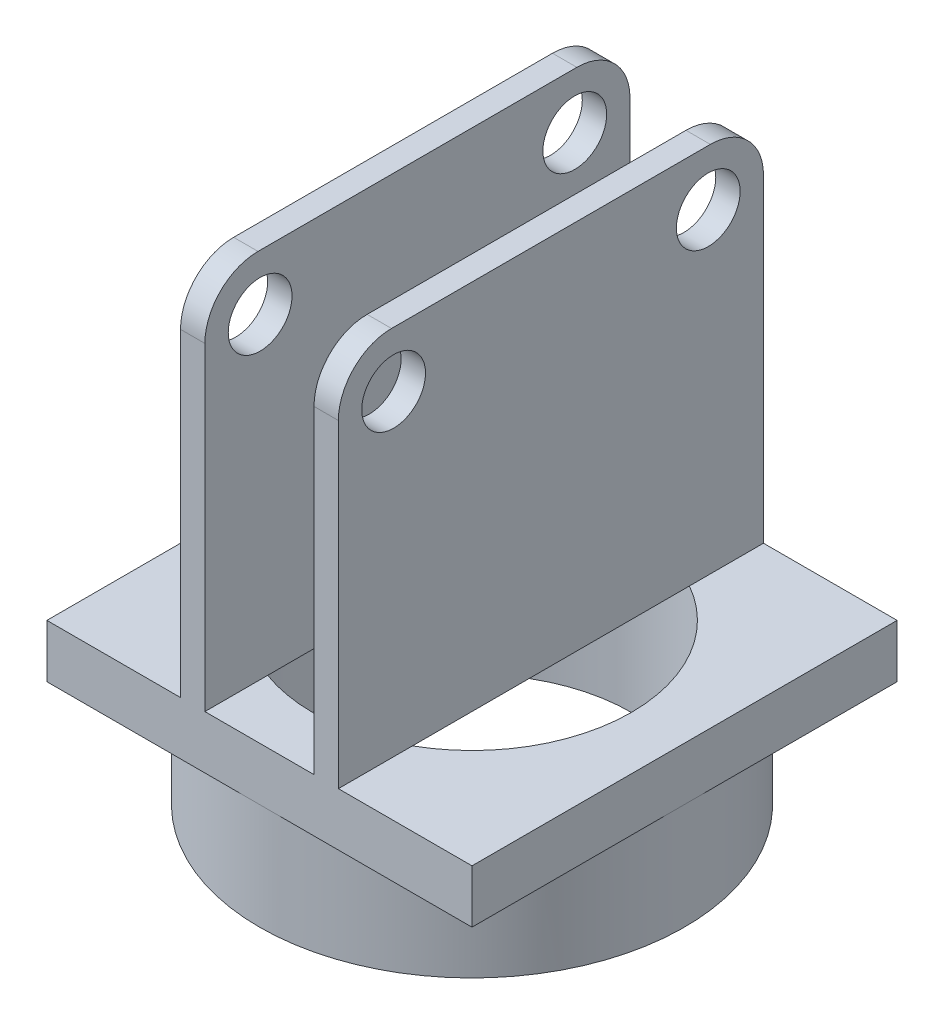
ISO-10303-21;
HEADER;
FILE_DESCRIPTION(('STEP AP214'),'2;1');
FILE_NAME('part.step','',(''),(''),'','','');
FILE_SCHEMA(('AUTOMOTIVE_DESIGN { 1 0 10303 214 1 1 1 1 }'));
ENDSEC;
DATA;
#1=APPLICATION_CONTEXT('core data for automotive mechanical design processes');
#2=APPLICATION_PROTOCOL_DEFINITION('international standard','automotive_design',2000,#1);
#3=PRODUCT_CONTEXT('',#1,'mechanical');
#4=PRODUCT('Part','Part','',(#3));
#5=PRODUCT_RELATED_PRODUCT_CATEGORY('part','',(#4));
#6=PRODUCT_DEFINITION_FORMATION('','',#4);
#7=PRODUCT_DEFINITION_CONTEXT('part definition',#1,'design');
#8=PRODUCT_DEFINITION('design','',#6,#7);
#9=PRODUCT_DEFINITION_SHAPE('','',#8);
#10=(LENGTH_UNIT() NAMED_UNIT(*) SI_UNIT(.MILLI.,.METRE.));
#11=(NAMED_UNIT(*) PLANE_ANGLE_UNIT() SI_UNIT($,.RADIAN.));
#12=(NAMED_UNIT(*) SI_UNIT($,.STERADIAN.) SOLID_ANGLE_UNIT());
#13=UNCERTAINTY_MEASURE_WITH_UNIT(LENGTH_MEASURE(1.E-05),#10,'distance_accuracy_value','');
#14=(GEOMETRIC_REPRESENTATION_CONTEXT(3) GLOBAL_UNCERTAINTY_ASSIGNED_CONTEXT((#13)) GLOBAL_UNIT_ASSIGNED_CONTEXT((#10,
#11,#12)) REPRESENTATION_CONTEXT('',''));
#15=CARTESIAN_POINT('',(0.,0.,0.));
#16=DIRECTION('',(0.,0.,1.));
#17=DIRECTION('',(1.,0.,0.));
#18=AXIS2_PLACEMENT_3D('',#15,#16,#17);
#19=CARTESIAN_POINT('',(0.,45.,-15.));
#20=DIRECTION('',(1.,0.,0.));
#21=DIRECTION('',(0.,0.,-1.));
#22=AXIS2_PLACEMENT_3D('',#19,#20,#21);
#23=CYLINDRICAL_SURFACE('',#22,5.);
#24=CARTESIAN_POINT('',(-5.13337044600348,45.,-15.));
#25=DIRECTION('',(-1.,0.,0.));
#26=DIRECTION('',(0.,0.,1.));
#27=AXIS2_PLACEMENT_3D('',#24,#25,#26);
#28=CIRCLE('',#27,5.);
#29=CARTESIAN_POINT('',(-5.13337044600348,45.,-20.));
#30=VERTEX_POINT('',#29);
#31=CARTESIAN_POINT('',(-5.13337044600348,50.,-15.));
#32=VERTEX_POINT('',#31);
#33=EDGE_CURVE('E243',#30,#32,#28,.F.);
#34=ORIENTED_EDGE('',*,*,#33,.F.);
#35=DIRECTION('',(-1.,0.,0.));
#36=VECTOR('',#35,1.);
#37=CARTESIAN_POINT('',(0.,45.,-20.));
#38=LINE('',#37,#36);
#39=CARTESIAN_POINT('',(-7.42681312800642,45.,-20.));
#40=VERTEX_POINT('',#39);
#41=EDGE_CURVE('E212',#40,#30,#38,.F.);
#42=ORIENTED_EDGE('',*,*,#41,.F.);
#43=CARTESIAN_POINT('',(-7.42681312800642,45.,-15.));
#44=DIRECTION('',(1.,0.,0.));
#45=DIRECTION('',(0.,0.,-1.));
#46=AXIS2_PLACEMENT_3D('',#43,#44,#45);
#47=CIRCLE('',#46,5.);
#48=CARTESIAN_POINT('',(-7.42681312800642,50.,-15.));
#49=VERTEX_POINT('',#48);
#50=EDGE_CURVE('E48',#49,#40,#47,.F.);
#51=ORIENTED_EDGE('',*,*,#50,.F.);
#52=DIRECTION('',(-1.,0.,0.));
#53=VECTOR('',#52,1.);
#54=CARTESIAN_POINT('',(0.,50.,-15.));
#55=LINE('',#54,#53);
#56=EDGE_CURVE('E210',#32,#49,#55,.T.);
#57=ORIENTED_EDGE('',*,*,#56,.F.);
#58=EDGE_LOOP('',(#34,#42,#51,#57));
#59=FACE_BOUND('',#58,.T.);
#60=ADVANCED_FACE('F40',(#59),#23,.T.);
#61=CARTESIAN_POINT('',(-20.,45.,15.));
#62=DIRECTION('',(-1.,0.,0.));
#63=DIRECTION('',(0.,0.,1.));
#64=AXIS2_PLACEMENT_3D('',#61,#62,#63);
#65=CYLINDRICAL_SURFACE('',#64,5.);
#66=CARTESIAN_POINT('',(-5.13337044600348,45.,15.));
#67=DIRECTION('',(-1.,0.,0.));
#68=DIRECTION('',(0.,0.,1.));
#69=AXIS2_PLACEMENT_3D('',#66,#67,#68);
#70=CIRCLE('',#69,5.);
#71=CARTESIAN_POINT('',(-5.13337044600348,50.,15.));
#72=VERTEX_POINT('',#71);
#73=CARTESIAN_POINT('',(-5.13337044600348,45.,20.));
#74=VERTEX_POINT('',#73);
#75=EDGE_CURVE('E236',#72,#74,#70,.F.);
#76=ORIENTED_EDGE('',*,*,#75,.F.);
#77=DIRECTION('',(-1.,0.,0.));
#78=VECTOR('',#77,1.);
#79=CARTESIAN_POINT('',(0.,50.,15.));
#80=LINE('',#79,#78);
#81=CARTESIAN_POINT('',(-7.42681312800642,50.,15.));
#82=VERTEX_POINT('',#81);
#83=EDGE_CURVE('E340',#82,#72,#80,.F.);
#84=ORIENTED_EDGE('',*,*,#83,.F.);
#85=CARTESIAN_POINT('',(-7.42681312800642,45.,15.));
#86=DIRECTION('',(1.,0.,0.));
#87=DIRECTION('',(0.,0.,-1.));
#88=AXIS2_PLACEMENT_3D('',#85,#86,#87);
#89=CIRCLE('',#88,5.);
#90=CARTESIAN_POINT('',(-7.42681312800642,45.,20.));
#91=VERTEX_POINT('',#90);
#92=EDGE_CURVE('E214',#91,#82,#89,.F.);
#93=ORIENTED_EDGE('',*,*,#92,.F.);
#94=DIRECTION('',(-1.,0.,0.));
#95=VECTOR('',#94,1.);
#96=CARTESIAN_POINT('',(-20.,45.,20.));
#97=LINE('',#96,#95);
#98=EDGE_CURVE('E339',#74,#91,#97,.T.);
#99=ORIENTED_EDGE('',*,*,#98,.F.);
#100=EDGE_LOOP('',(#76,#84,#93,#99));
#101=FACE_BOUND('',#100,.T.);
#102=ADVANCED_FACE('F357',(#101),#65,.T.);
#103=CARTESIAN_POINT('',(0.,50.,0.));
#104=DIRECTION('',(0.,-1.,0.));
#105=DIRECTION('',(0.,0.,-1.));
#106=AXIS2_PLACEMENT_3D('',#103,#104,#105);
#107=PLANE('',#106);
#108=ORIENTED_EDGE('',*,*,#83,.T.);
#109=DIRECTION('',(0.,0.,1.));
#110=VECTOR('',#109,1.);
#111=CARTESIAN_POINT('',(-5.13337044600348,50.,-24.3367364571441));
#112=LINE('',#111,#110);
#113=EDGE_CURVE('E195',#32,#72,#112,.T.);
#114=ORIENTED_EDGE('',*,*,#113,.F.);
#115=ORIENTED_EDGE('',*,*,#56,.T.);
#116=DIRECTION('',(0.,0.,1.));
#117=VECTOR('',#116,1.);
#118=CARTESIAN_POINT('',(-7.42681312800642,50.,-20.));
#119=LINE('',#118,#117);
#120=EDGE_CURVE('E260',#49,#82,#119,.T.);
#121=ORIENTED_EDGE('',*,*,#120,.T.);
#122=EDGE_LOOP('',(#108,#114,#115,#121));
#123=FACE_BOUND('',#122,.T.);
#124=ADVANCED_FACE('F360',(#123),#107,.F.);
#125=CARTESIAN_POINT('',(0.,15.,0.));
#126=DIRECTION('',(0.,-1.,0.));
#127=DIRECTION('',(0.,0.,-1.));
#128=AXIS2_PLACEMENT_3D('',#125,#126,#127);
#129=PLANE('',#128);
#130=DIRECTION('',(0.,0.,1.));
#131=VECTOR('',#130,1.);
#132=CARTESIAN_POINT('',(-5.13337044600348,15.,-24.3367364571441));
#133=LINE('',#132,#131);
#134=CARTESIAN_POINT('',(-5.13337044600348,15.,-14.0942721651066));
#135=VERTEX_POINT('',#134);
#136=CARTESIAN_POINT('',(-5.13337044600348,15.,14.0942721651066));
#137=VERTEX_POINT('',#136);
#138=EDGE_CURVE('E427',#135,#137,#133,.T.);
#139=ORIENTED_EDGE('',*,*,#138,.T.);
#140=CARTESIAN_POINT('',(0.,15.,0.));
#141=DIRECTION('',(0.,-1.,0.));
#142=DIRECTION('',(0.,0.,-1.));
#143=AXIS2_PLACEMENT_3D('',#140,#141,#142);
#144=CIRCLE('',#143,15.);
#145=CARTESIAN_POINT('',(-7.42681312800642,15.,13.0323615189908));
#146=VERTEX_POINT('',#145);
#147=EDGE_CURVE('E415',#137,#146,#144,.T.);
#148=ORIENTED_EDGE('',*,*,#147,.T.);
#149=DIRECTION('',(0.,0.,1.));
#150=VECTOR('',#149,1.);
#151=CARTESIAN_POINT('',(-7.42681312800642,15.,-20.));
#152=LINE('',#151,#150);
#153=CARTESIAN_POINT('',(-7.42681312800642,15.,-13.0323615189908));
#154=VERTEX_POINT('',#153);
#155=EDGE_CURVE('E259',#154,#146,#152,.T.);
#156=ORIENTED_EDGE('',*,*,#155,.F.);
#157=EDGE_CURVE('E416',#154,#135,#144,.T.);
#158=ORIENTED_EDGE('',*,*,#157,.T.);
#159=EDGE_LOOP('',(#139,#148,#156,#158));
#160=FACE_BOUND('',#159,.T.);
#161=ADVANCED_FACE('F426',(#160),#129,.T.);
#162=CARTESIAN_POINT('',(-27.5731868719936,44.7729681881626,14.8032311398829));
#163=DIRECTION('',(1.,0.,0.));
#164=DIRECTION('',(0.,0.,-1.));
#165=AXIS2_PLACEMENT_3D('',#162,#163,#164);
#166=CYLINDRICAL_SURFACE('',#165,3.);
#167=CARTESIAN_POINT('',(-5.13337044600348,44.7729681881626,14.8032311398829));
#168=DIRECTION('',(-1.,0.,0.));
#169=DIRECTION('',(0.,0.,1.));
#170=AXIS2_PLACEMENT_3D('',#167,#168,#169);
#171=CIRCLE('',#170,3.);
#172=CARTESIAN_POINT('',(-5.13337044600348,44.7729681881626,17.8032311398829));
#173=VERTEX_POINT('',#172);
#174=EDGE_CURVE('E227',#173,#173,#171,.F.);
#175=ORIENTED_EDGE('',*,*,#174,.T.);
#176=EDGE_LOOP('',(#175));
#177=FACE_BOUND('',#176,.T.);
#178=CARTESIAN_POINT('',(-7.42681312800642,44.7729681881626,14.8032311398829));
#179=DIRECTION('',(1.,0.,0.));
#180=DIRECTION('',(0.,0.,-1.));
#181=AXIS2_PLACEMENT_3D('',#178,#179,#180);
#182=CIRCLE('',#181,3.);
#183=CARTESIAN_POINT('',(-7.42681312800642,44.7729681881626,11.8032311398829));
#184=VERTEX_POINT('',#183);
#185=EDGE_CURVE('E251',#184,#184,#182,.T.);
#186=ORIENTED_EDGE('',*,*,#185,.F.);
#187=EDGE_LOOP('',(#186));
#188=FACE_BOUND('',#187,.T.);
#189=ADVANCED_FACE('F503',(#177,#188),#166,.F.);
#190=CARTESIAN_POINT('',(-27.5731868719936,44.7729681881626,-14.8032311398829));
#191=DIRECTION('',(1.,0.,0.));
#192=DIRECTION('',(0.,0.,-1.));
#193=AXIS2_PLACEMENT_3D('',#190,#191,#192);
#194=CYLINDRICAL_SURFACE('',#193,3.);
#195=CARTESIAN_POINT('',(-5.13337044600348,44.7729681881626,-14.8032311398829));
#196=DIRECTION('',(-1.,0.,0.));
#197=DIRECTION('',(0.,0.,1.));
#198=AXIS2_PLACEMENT_3D('',#195,#196,#197);
#199=CIRCLE('',#198,3.);
#200=CARTESIAN_POINT('',(-5.13337044600348,44.7729681881626,-11.8032311398829));
#201=VERTEX_POINT('',#200);
#202=EDGE_CURVE('E204',#201,#201,#199,.F.);
#203=ORIENTED_EDGE('',*,*,#202,.T.);
#204=EDGE_LOOP('',(#203));
#205=FACE_BOUND('',#204,.T.);
#206=CARTESIAN_POINT('',(-7.42681312800642,44.7729681881626,-14.8032311398829));
#207=DIRECTION('',(1.,0.,0.));
#208=DIRECTION('',(0.,0.,-1.));
#209=AXIS2_PLACEMENT_3D('',#206,#207,#208);
#210=CIRCLE('',#209,3.);
#211=CARTESIAN_POINT('',(-7.42681312800642,44.7729681881626,-17.8032311398829));
#212=VERTEX_POINT('',#211);
#213=EDGE_CURVE('E256',#212,#212,#210,.T.);
#214=ORIENTED_EDGE('',*,*,#213,.F.);
#215=EDGE_LOOP('',(#214));
#216=FACE_BOUND('',#215,.T.);
#217=ADVANCED_FACE('F498',(#205,#216),#194,.F.);
#218=CARTESIAN_POINT('',(5.13337044600348,45.,-15.));
#219=DIRECTION('',(1.,0.,0.));
#220=DIRECTION('',(0.,0.,-1.));
#221=AXIS2_PLACEMENT_3D('',#218,#219,#220);
#222=CIRCLE('',#221,5.);
#223=CARTESIAN_POINT('',(5.13337044600348,50.,-15.));
#224=VERTEX_POINT('',#223);
#225=CARTESIAN_POINT('',(5.13337044600348,45.,-20.));
#226=VERTEX_POINT('',#225);
#227=EDGE_CURVE('E189',#224,#226,#222,.F.);
#228=ORIENTED_EDGE('',*,*,#227,.F.);
#229=CARTESIAN_POINT('',(7.42681312800642,50.,-15.));
#230=VERTEX_POINT('',#229);
#231=EDGE_CURVE('E201',#230,#224,#55,.T.);
#232=ORIENTED_EDGE('',*,*,#231,.F.);
#233=CARTESIAN_POINT('',(7.42681312800642,45.,-15.));
#234=DIRECTION('',(-1.,0.,0.));
#235=DIRECTION('',(0.,0.,1.));
#236=AXIS2_PLACEMENT_3D('',#233,#234,#235);
#237=CIRCLE('',#236,5.);
#238=CARTESIAN_POINT('',(7.42681312800642,45.,-20.));
#239=VERTEX_POINT('',#238);
#240=EDGE_CURVE('E219',#239,#230,#237,.F.);
#241=ORIENTED_EDGE('',*,*,#240,.F.);
#242=EDGE_CURVE('E203',#226,#239,#38,.F.);
#243=ORIENTED_EDGE('',*,*,#242,.F.);
#244=EDGE_LOOP('',(#228,#232,#241,#243));
#245=FACE_BOUND('',#244,.T.);
#246=ADVANCED_FACE('F42',(#245),#23,.T.);
#247=CARTESIAN_POINT('',(5.13337044600348,45.,15.));
#248=DIRECTION('',(1.,0.,0.));
#249=DIRECTION('',(0.,0.,-1.));
#250=AXIS2_PLACEMENT_3D('',#247,#248,#249);
#251=CIRCLE('',#250,5.);
#252=CARTESIAN_POINT('',(5.13337044600348,45.,20.));
#253=VERTEX_POINT('',#252);
#254=CARTESIAN_POINT('',(5.13337044600348,50.,15.));
#255=VERTEX_POINT('',#254);
#256=EDGE_CURVE('E55',#253,#255,#251,.F.);
#257=ORIENTED_EDGE('',*,*,#256,.F.);
#258=CARTESIAN_POINT('',(7.42681312800642,45.,20.));
#259=VERTEX_POINT('',#258);
#260=EDGE_CURVE('E335',#259,#253,#97,.T.);
#261=ORIENTED_EDGE('',*,*,#260,.F.);
#262=CARTESIAN_POINT('',(7.42681312800642,45.,15.));
#263=DIRECTION('',(-1.,0.,0.));
#264=DIRECTION('',(0.,0.,1.));
#265=AXIS2_PLACEMENT_3D('',#262,#263,#264);
#266=CIRCLE('',#265,5.);
#267=CARTESIAN_POINT('',(7.42681312800642,50.,15.));
#268=VERTEX_POINT('',#267);
#269=EDGE_CURVE('E342',#268,#259,#266,.F.);
#270=ORIENTED_EDGE('',*,*,#269,.F.);
#271=EDGE_CURVE('E338',#255,#268,#80,.F.);
#272=ORIENTED_EDGE('',*,*,#271,.F.);
#273=EDGE_LOOP('',(#257,#261,#270,#272));
#274=FACE_BOUND('',#273,.T.);
#275=ADVANCED_FACE('F448',(#274),#65,.T.);
#276=CARTESIAN_POINT('',(0.,15.,0.));
#277=DIRECTION('',(0.,-1.,0.));
#278=DIRECTION('',(0.,0.,-1.));
#279=AXIS2_PLACEMENT_3D('',#276,#277,#278);
#280=PLANE('',#279);
#281=CARTESIAN_POINT('',(-7.42681312800642,15.,-20.));
#282=VERTEX_POINT('',#281);
#283=EDGE_CURVE('E265',#282,#154,#152,.T.);
#284=ORIENTED_EDGE('',*,*,#283,.F.);
#285=DIRECTION('',(1.,0.,0.));
#286=VECTOR('',#285,1.);
#287=CARTESIAN_POINT('',(-20.,15.,-20.));
#288=LINE('',#287,#286);
#289=CARTESIAN_POINT('',(-20.,15.,-20.));
#290=VERTEX_POINT('',#289);
#291=EDGE_CURVE('E285',#290,#282,#288,.T.);
#292=ORIENTED_EDGE('',*,*,#291,.F.);
#293=DIRECTION('',(0.,0.,1.));
#294=VECTOR('',#293,1.);
#295=CARTESIAN_POINT('',(-20.,15.,-20.));
#296=LINE('',#295,#294);
#297=CARTESIAN_POINT('',(-20.,15.,20.));
#298=VERTEX_POINT('',#297);
#299=EDGE_CURVE('E296',#290,#298,#296,.T.);
#300=ORIENTED_EDGE('',*,*,#299,.T.);
#301=DIRECTION('',(1.,0.,0.));
#302=VECTOR('',#301,1.);
#303=CARTESIAN_POINT('',(-20.,15.,20.));
#304=LINE('',#303,#302);
#305=CARTESIAN_POINT('',(-7.42681312800642,15.,20.));
#306=VERTEX_POINT('',#305);
#307=EDGE_CURVE('E293',#298,#306,#304,.T.);
#308=ORIENTED_EDGE('',*,*,#307,.T.);
#309=EDGE_CURVE('E269',#146,#306,#152,.T.);
#310=ORIENTED_EDGE('',*,*,#309,.F.);
#311=EDGE_CURVE('E376',#146,#154,#144,.T.);
#312=ORIENTED_EDGE('',*,*,#311,.T.);
#313=EDGE_LOOP('',(#284,#292,#300,#308,#310,#312));
#314=FACE_BOUND('',#313,.T.);
#315=ADVANCED_FACE('F373',(#314),#280,.F.);
#316=DIRECTION('',(0.,0.,-1.));
#317=VECTOR('',#316,1.);
#318=CARTESIAN_POINT('',(7.42681312800642,15.,-20.));
#319=LINE('',#318,#317);
#320=CARTESIAN_POINT('',(7.42681312800642,15.,20.));
#321=VERTEX_POINT('',#320);
#322=CARTESIAN_POINT('',(7.42681312800642,15.,13.0323615189908));
#323=VERTEX_POINT('',#322);
#324=EDGE_CURVE('E262',#321,#323,#319,.T.);
#325=ORIENTED_EDGE('',*,*,#324,.F.);
#326=CARTESIAN_POINT('',(20.,15.,20.));
#327=VERTEX_POINT('',#326);
#328=EDGE_CURVE('E292',#321,#327,#304,.T.);
#329=ORIENTED_EDGE('',*,*,#328,.T.);
#330=DIRECTION('',(0.,0.,1.));
#331=VECTOR('',#330,1.);
#332=CARTESIAN_POINT('',(20.,15.,-20.));
#333=LINE('',#332,#331);
#334=CARTESIAN_POINT('',(20.,15.,-20.));
#335=VERTEX_POINT('',#334);
#336=EDGE_CURVE('E288',#335,#327,#333,.T.);
#337=ORIENTED_EDGE('',*,*,#336,.F.);
#338=CARTESIAN_POINT('',(7.42681312800642,15.,-20.));
#339=VERTEX_POINT('',#338);
#340=EDGE_CURVE('E289',#339,#335,#288,.T.);
#341=ORIENTED_EDGE('',*,*,#340,.F.);
#342=CARTESIAN_POINT('',(7.42681312800642,15.,-13.0323615189908));
#343=VERTEX_POINT('',#342);
#344=EDGE_CURVE('E272',#343,#339,#319,.T.);
#345=ORIENTED_EDGE('',*,*,#344,.F.);
#346=EDGE_CURVE('E281',#343,#323,#144,.T.);
#347=ORIENTED_EDGE('',*,*,#346,.T.);
#348=EDGE_LOOP('',(#325,#329,#337,#341,#345,#347));
#349=FACE_BOUND('',#348,.T.);
#350=ADVANCED_FACE('F409',(#349),#280,.F.);
#351=CARTESIAN_POINT('',(0.,0.,0.));
#352=DIRECTION('',(0.,1.,0.));
#353=DIRECTION('',(0.,0.,1.));
#354=AXIS2_PLACEMENT_3D('',#351,#352,#353);
#355=PLANE('',#354);
#356=CARTESIAN_POINT('',(0.,0.,0.));
#357=DIRECTION('',(0.,1.,0.));
#358=DIRECTION('',(0.,0.,1.));
#359=AXIS2_PLACEMENT_3D('',#356,#357,#358);
#360=CIRCLE('',#359,20.);
#361=CARTESIAN_POINT('',(0.,0.,20.));
#362=VERTEX_POINT('',#361);
#363=EDGE_CURVE('E327',#362,#362,#360,.T.);
#364=ORIENTED_EDGE('',*,*,#363,.F.);
#365=EDGE_LOOP('',(#364));
#366=FACE_BOUND('',#365,.T.);
#367=CARTESIAN_POINT('',(0.,0.,0.));
#368=DIRECTION('',(0.,1.,0.));
#369=DIRECTION('',(0.,0.,1.));
#370=AXIS2_PLACEMENT_3D('',#367,#368,#369);
#371=CIRCLE('',#370,15.);
#372=CARTESIAN_POINT('',(0.,0.,15.));
#373=VERTEX_POINT('',#372);
#374=EDGE_CURVE('E316',#373,#373,#371,.T.);
#375=ORIENTED_EDGE('',*,*,#374,.T.);
#376=EDGE_LOOP('',(#375));
#377=FACE_BOUND('',#376,.T.);
#378=ADVANCED_FACE('F477',(#366,#377),#355,.F.);
#379=CARTESIAN_POINT('',(0.,10.,0.));
#380=DIRECTION('',(0.,-1.,0.));
#381=DIRECTION('',(0.,0.,-1.));
#382=AXIS2_PLACEMENT_3D('',#379,#380,#381);
#383=CYLINDRICAL_SURFACE('',#382,20.);
#384=CARTESIAN_POINT('',(0.,10.,0.));
#385=DIRECTION('',(0.,1.,0.));
#386=DIRECTION('',(0.,0.,1.));
#387=AXIS2_PLACEMENT_3D('',#384,#385,#386);
#388=CIRCLE('',#387,20.);
#389=CARTESIAN_POINT('',(0.,10.,20.));
#390=VERTEX_POINT('',#389);
#391=CARTESIAN_POINT('',(20.,10.,0.));
#392=VERTEX_POINT('',#391);
#393=EDGE_CURVE('E328',#390,#392,#388,.T.);
#394=ORIENTED_EDGE('',*,*,#393,.F.);
#395=CARTESIAN_POINT('',(-20.,10.,0.));
#396=VERTEX_POINT('',#395);
#397=EDGE_CURVE('E332',#396,#390,#388,.T.);
#398=ORIENTED_EDGE('',*,*,#397,.F.);
#399=CARTESIAN_POINT('',(0.,10.,-20.));
#400=VERTEX_POINT('',#399);
#401=EDGE_CURVE('E464',#400,#396,#388,.T.);
#402=ORIENTED_EDGE('',*,*,#401,.F.);
#403=EDGE_CURVE('E331',#392,#400,#388,.T.);
#404=ORIENTED_EDGE('',*,*,#403,.F.);
#405=EDGE_LOOP('',(#394,#398,#402,#404));
#406=FACE_BOUND('',#405,.T.);
#407=ORIENTED_EDGE('',*,*,#363,.T.);
#408=EDGE_LOOP('',(#407));
#409=FACE_BOUND('',#408,.T.);
#410=ADVANCED_FACE('F474',(#406,#409),#383,.T.);
#411=CARTESIAN_POINT('',(0.,10.,0.));
#412=DIRECTION('',(0.,-1.,0.));
#413=DIRECTION('',(0.,0.,-1.));
#414=AXIS2_PLACEMENT_3D('',#411,#412,#413);
#415=CYLINDRICAL_SURFACE('',#414,15.);
#416=ORIENTED_EDGE('',*,*,#374,.F.);
#417=EDGE_LOOP('',(#416));
#418=FACE_BOUND('',#417,.T.);
#419=ORIENTED_EDGE('',*,*,#346,.F.);
#420=CARTESIAN_POINT('',(5.13337044600348,15.,-14.0942721651066));
#421=VERTEX_POINT('',#420);
#422=EDGE_CURVE('E280',#421,#343,#144,.T.);
#423=ORIENTED_EDGE('',*,*,#422,.F.);
#424=EDGE_CURVE('E406',#135,#421,#144,.T.);
#425=ORIENTED_EDGE('',*,*,#424,.F.);
#426=ORIENTED_EDGE('',*,*,#157,.F.);
#427=ORIENTED_EDGE('',*,*,#311,.F.);
#428=ORIENTED_EDGE('',*,*,#147,.F.);
#429=CARTESIAN_POINT('',(5.13337044600348,15.,14.0942721651066));
#430=VERTEX_POINT('',#429);
#431=EDGE_CURVE('E414',#430,#137,#144,.T.);
#432=ORIENTED_EDGE('',*,*,#431,.F.);
#433=EDGE_CURVE('E284',#323,#430,#144,.T.);
#434=ORIENTED_EDGE('',*,*,#433,.F.);
#435=EDGE_LOOP('',(#419,#423,#425,#426,#427,#428,#432,#434));
#436=FACE_BOUND('',#435,.T.);
#437=ADVANCED_FACE('F411',(#418,#436),#415,.F.);
#438=CARTESIAN_POINT('',(0.,10.,0.));
#439=DIRECTION('',(0.,-1.,0.));
#440=DIRECTION('',(0.,0.,-1.));
#441=AXIS2_PLACEMENT_3D('',#438,#439,#440);
#442=PLANE('',#441);
#443=DIRECTION('',(1.,0.,0.));
#444=VECTOR('',#443,1.);
#445=CARTESIAN_POINT('',(-20.,10.,20.));
#446=LINE('',#445,#444);
#447=CARTESIAN_POINT('',(20.,10.,20.));
#448=VERTEX_POINT('',#447);
#449=EDGE_CURVE('E306',#390,#448,#446,.T.);
#450=ORIENTED_EDGE('',*,*,#449,.F.);
#451=ORIENTED_EDGE('',*,*,#393,.T.);
#452=DIRECTION('',(0.,0.,1.));
#453=VECTOR('',#452,1.);
#454=CARTESIAN_POINT('',(20.,10.,-20.));
#455=LINE('',#454,#453);
#456=EDGE_CURVE('E302',#392,#448,#455,.T.);
#457=ORIENTED_EDGE('',*,*,#456,.T.);
#458=EDGE_LOOP('',(#450,#451,#457));
#459=FACE_BOUND('',#458,.T.);
#460=ADVANCED_FACE('F472',(#459),#442,.T.);
#461=CARTESIAN_POINT('',(20.,10.,-20.));
#462=VERTEX_POINT('',#461);
#463=EDGE_CURVE('E303',#462,#392,#455,.T.);
#464=ORIENTED_EDGE('',*,*,#463,.T.);
#465=ORIENTED_EDGE('',*,*,#403,.T.);
#466=DIRECTION('',(1.,0.,0.));
#467=VECTOR('',#466,1.);
#468=CARTESIAN_POINT('',(-20.,10.,-20.));
#469=LINE('',#468,#467);
#470=EDGE_CURVE('E283',#400,#462,#469,.T.);
#471=ORIENTED_EDGE('',*,*,#470,.T.);
#472=EDGE_LOOP('',(#464,#465,#471));
#473=FACE_BOUND('',#472,.T.);
#474=ADVANCED_FACE('F473',(#473),#442,.T.);
#475=CARTESIAN_POINT('',(-20.,10.,-20.));
#476=VERTEX_POINT('',#475);
#477=EDGE_CURVE('E299',#476,#400,#469,.T.);
#478=ORIENTED_EDGE('',*,*,#477,.T.);
#479=ORIENTED_EDGE('',*,*,#401,.T.);
#480=DIRECTION('',(0.,0.,1.));
#481=VECTOR('',#480,1.);
#482=CARTESIAN_POINT('',(-20.,10.,-20.));
#483=LINE('',#482,#481);
#484=EDGE_CURVE('E311',#476,#396,#483,.T.);
#485=ORIENTED_EDGE('',*,*,#484,.F.);
#486=EDGE_LOOP('',(#478,#479,#485));
#487=FACE_BOUND('',#486,.T.);
#488=ADVANCED_FACE('F463',(#487),#442,.T.);
#489=CARTESIAN_POINT('',(-20.,15.,-20.));
#490=DIRECTION('',(0.,0.,-1.));
#491=DIRECTION('',(-1.,0.,0.));
#492=AXIS2_PLACEMENT_3D('',#489,#490,#491);
#493=PLANE('',#492);
#494=DIRECTION('',(0.,1.,0.));
#495=VECTOR('',#494,1.);
#496=CARTESIAN_POINT('',(-5.13337044600348,15.,-20.));
#497=LINE('',#496,#495);
#498=CARTESIAN_POINT('',(-5.13337044600348,15.,-20.));
#499=VERTEX_POINT('',#498);
#500=EDGE_CURVE('E241',#499,#30,#497,.T.);
#501=ORIENTED_EDGE('',*,*,#500,.F.);
#502=DIRECTION('',(-1.,0.,0.));
#503=VECTOR('',#502,1.);
#504=CARTESIAN_POINT('',(-20.,15.,-20.));
#505=LINE('',#504,#503);
#506=CARTESIAN_POINT('',(5.13337044600348,15.,-20.));
#507=VERTEX_POINT('',#506);
#508=EDGE_CURVE('E245',#507,#499,#505,.T.);
#509=ORIENTED_EDGE('',*,*,#508,.F.);
#510=DIRECTION('',(0.,-1.,0.));
#511=VECTOR('',#510,1.);
#512=CARTESIAN_POINT('',(5.13337044600348,15.,-20.));
#513=LINE('',#512,#511);
#514=EDGE_CURVE('E205',#226,#507,#513,.T.);
#515=ORIENTED_EDGE('',*,*,#514,.F.);
#516=ORIENTED_EDGE('',*,*,#242,.T.);
#517=DIRECTION('',(0.,-1.,0.));
#518=VECTOR('',#517,1.);
#519=CARTESIAN_POINT('',(7.42681312800642,50.,-20.));
#520=LINE('',#519,#518);
#521=EDGE_CURVE('E274',#239,#339,#520,.T.);
#522=ORIENTED_EDGE('',*,*,#521,.T.);
#523=ORIENTED_EDGE('',*,*,#340,.T.);
#524=DIRECTION('',(0.,-1.,0.));
#525=VECTOR('',#524,1.);
#526=CARTESIAN_POINT('',(20.,15.,-20.));
#527=LINE('',#526,#525);
#528=EDGE_CURVE('E298',#335,#462,#527,.T.);
#529=ORIENTED_EDGE('',*,*,#528,.T.);
#530=ORIENTED_EDGE('',*,*,#470,.F.);
#531=ORIENTED_EDGE('',*,*,#477,.F.);
#532=DIRECTION('',(0.,-1.,0.));
#533=VECTOR('',#532,1.);
#534=CARTESIAN_POINT('',(-20.,15.,-20.));
#535=LINE('',#534,#533);
#536=EDGE_CURVE('E314',#290,#476,#535,.T.);
#537=ORIENTED_EDGE('',*,*,#536,.F.);
#538=ORIENTED_EDGE('',*,*,#291,.T.);
#539=DIRECTION('',(0.,-1.,0.));
#540=VECTOR('',#539,1.);
#541=CARTESIAN_POINT('',(-7.42681312800642,50.,-20.));
#542=LINE('',#541,#540);
#543=EDGE_CURVE('E264',#40,#282,#542,.T.);
#544=ORIENTED_EDGE('',*,*,#543,.F.);
#545=ORIENTED_EDGE('',*,*,#41,.T.);
#546=EDGE_LOOP('',(#501,#509,#515,#516,#522,#523,#529,#530,#531,#537,#538,#544,#545));
#547=FACE_BOUND('',#546,.T.);
#548=ADVANCED_FACE('F379',(#547),#493,.T.);
#549=CARTESIAN_POINT('',(-20.,15.,-20.));
#550=DIRECTION('',(1.,0.,0.));
#551=DIRECTION('',(0.,0.,-1.));
#552=AXIS2_PLACEMENT_3D('',#549,#550,#551);
#553=PLANE('',#552);
#554=ORIENTED_EDGE('',*,*,#484,.T.);
#555=CARTESIAN_POINT('',(-20.,10.,20.));
#556=VERTEX_POINT('',#555);
#557=EDGE_CURVE('E310',#396,#556,#483,.T.);
#558=ORIENTED_EDGE('',*,*,#557,.T.);
#559=DIRECTION('',(0.,-1.,0.));
#560=VECTOR('',#559,1.);
#561=CARTESIAN_POINT('',(-20.,15.,20.));
#562=LINE('',#561,#560);
#563=EDGE_CURVE('E317',#298,#556,#562,.T.);
#564=ORIENTED_EDGE('',*,*,#563,.F.);
#565=ORIENTED_EDGE('',*,*,#299,.F.);
#566=ORIENTED_EDGE('',*,*,#536,.T.);
#567=EDGE_LOOP('',(#554,#558,#564,#565,#566));
#568=FACE_BOUND('',#567,.T.);
#569=ADVANCED_FACE('F386',(#568),#553,.F.);
#570=CARTESIAN_POINT('',(-20.,15.,20.));
#571=DIRECTION('',(0.,0.,-1.));
#572=DIRECTION('',(-1.,0.,0.));
#573=AXIS2_PLACEMENT_3D('',#570,#571,#572);
#574=PLANE('',#573);
#575=DIRECTION('',(-1.,0.,0.));
#576=VECTOR('',#575,1.);
#577=CARTESIAN_POINT('',(-20.,15.,20.));
#578=LINE('',#577,#576);
#579=CARTESIAN_POINT('',(5.13337044600348,15.,20.));
#580=VERTEX_POINT('',#579);
#581=CARTESIAN_POINT('',(-5.13337044600348,15.,20.));
#582=VERTEX_POINT('',#581);
#583=EDGE_CURVE('E12',#580,#582,#578,.T.);
#584=ORIENTED_EDGE('',*,*,#583,.T.);
#585=DIRECTION('',(0.,1.,0.));
#586=VECTOR('',#585,1.);
#587=CARTESIAN_POINT('',(-5.13337044600348,15.,20.));
#588=LINE('',#587,#586);
#589=EDGE_CURVE('E231',#582,#74,#588,.T.);
#590=ORIENTED_EDGE('',*,*,#589,.T.);
#591=ORIENTED_EDGE('',*,*,#98,.T.);
#592=DIRECTION('',(0.,-1.,0.));
#593=VECTOR('',#592,1.);
#594=CARTESIAN_POINT('',(-7.42681312800642,50.,20.));
#595=LINE('',#594,#593);
#596=EDGE_CURVE('E278',#91,#306,#595,.T.);
#597=ORIENTED_EDGE('',*,*,#596,.T.);
#598=ORIENTED_EDGE('',*,*,#307,.F.);
#599=ORIENTED_EDGE('',*,*,#563,.T.);
#600=EDGE_CURVE('E307',#556,#390,#446,.T.);
#601=ORIENTED_EDGE('',*,*,#600,.T.);
#602=ORIENTED_EDGE('',*,*,#449,.T.);
#603=DIRECTION('',(0.,-1.,0.));
#604=VECTOR('',#603,1.);
#605=CARTESIAN_POINT('',(20.,15.,20.));
#606=LINE('',#605,#604);
#607=EDGE_CURVE('E320',#327,#448,#606,.T.);
#608=ORIENTED_EDGE('',*,*,#607,.F.);
#609=ORIENTED_EDGE('',*,*,#328,.F.);
#610=DIRECTION('',(0.,-1.,0.));
#611=VECTOR('',#610,1.);
#612=CARTESIAN_POINT('',(7.42681312800642,50.,20.));
#613=LINE('',#612,#611);
#614=EDGE_CURVE('E276',#259,#321,#613,.T.);
#615=ORIENTED_EDGE('',*,*,#614,.F.);
#616=ORIENTED_EDGE('',*,*,#260,.T.);
#617=DIRECTION('',(0.,-1.,0.));
#618=VECTOR('',#617,1.);
#619=CARTESIAN_POINT('',(5.13337044600348,15.,20.));
#620=LINE('',#619,#618);
#621=EDGE_CURVE('E437',#253,#580,#620,.T.);
#622=ORIENTED_EDGE('',*,*,#621,.T.);
#623=EDGE_LOOP('',(#584,#590,#591,#597,#598,#599,#601,#602,#608,#609,#615,#616,#622));
#624=FACE_BOUND('',#623,.T.);
#625=ADVANCED_FACE('F442',(#624),#574,.F.);
#626=CARTESIAN_POINT('',(20.,15.,-20.));
#627=DIRECTION('',(1.,0.,0.));
#628=DIRECTION('',(0.,0.,-1.));
#629=AXIS2_PLACEMENT_3D('',#626,#627,#628);
#630=PLANE('',#629);
#631=ORIENTED_EDGE('',*,*,#463,.F.);
#632=ORIENTED_EDGE('',*,*,#528,.F.);
#633=ORIENTED_EDGE('',*,*,#336,.T.);
#634=ORIENTED_EDGE('',*,*,#607,.T.);
#635=ORIENTED_EDGE('',*,*,#456,.F.);
#636=EDGE_LOOP('',(#631,#632,#633,#634,#635));
#637=FACE_BOUND('',#636,.T.);
#638=ADVANCED_FACE('F458',(#637),#630,.T.);
#639=ORIENTED_EDGE('',*,*,#557,.F.);
#640=ORIENTED_EDGE('',*,*,#397,.T.);
#641=ORIENTED_EDGE('',*,*,#600,.F.);
#642=EDGE_LOOP('',(#639,#640,#641));
#643=FACE_BOUND('',#642,.T.);
#644=ADVANCED_FACE('F469',(#643),#442,.T.);
#645=CARTESIAN_POINT('',(-7.42681312800642,50.,-20.));
#646=DIRECTION('',(1.,0.,0.));
#647=DIRECTION('',(0.,0.,-1.));
#648=AXIS2_PLACEMENT_3D('',#645,#646,#647);
#649=PLANE('',#648);
#650=ORIENTED_EDGE('',*,*,#213,.T.);
#651=EDGE_LOOP('',(#650));
#652=FACE_BOUND('',#651,.T.);
#653=ORIENTED_EDGE('',*,*,#185,.T.);
#654=EDGE_LOOP('',(#653));
#655=FACE_BOUND('',#654,.T.);
#656=ORIENTED_EDGE('',*,*,#120,.F.);
#657=ORIENTED_EDGE('',*,*,#50,.T.);
#658=ORIENTED_EDGE('',*,*,#543,.T.);
#659=ORIENTED_EDGE('',*,*,#283,.T.);
#660=ORIENTED_EDGE('',*,*,#155,.T.);
#661=ORIENTED_EDGE('',*,*,#309,.T.);
#662=ORIENTED_EDGE('',*,*,#596,.F.);
#663=ORIENTED_EDGE('',*,*,#92,.T.);
#664=EDGE_LOOP('',(#656,#657,#658,#659,#660,#661,#662,#663));
#665=FACE_BOUND('',#664,.T.);
#666=ADVANCED_FACE('F352',(#652,#655,#665),#649,.F.);
#667=CARTESIAN_POINT('',(7.42681312800642,50.,-20.));
#668=DIRECTION('',(-1.,0.,0.));
#669=DIRECTION('',(0.,0.,1.));
#670=AXIS2_PLACEMENT_3D('',#667,#668,#669);
#671=PLANE('',#670);
#672=CARTESIAN_POINT('',(7.42681312800642,44.7729681881626,-14.8032311398829));
#673=DIRECTION('',(1.,0.,0.));
#674=DIRECTION('',(0.,0.,-1.));
#675=AXIS2_PLACEMENT_3D('',#672,#673,#674);
#676=CIRCLE('',#675,3.);
#677=CARTESIAN_POINT('',(7.42681312800642,44.7729681881626,-17.8032311398829));
#678=VERTEX_POINT('',#677);
#679=EDGE_CURVE('E248',#678,#678,#676,.T.);
#680=ORIENTED_EDGE('',*,*,#679,.F.);
#681=EDGE_LOOP('',(#680));
#682=FACE_BOUND('',#681,.T.);
#683=CARTESIAN_POINT('',(7.42681312800642,44.7729681881626,14.8032311398829));
#684=DIRECTION('',(1.,0.,0.));
#685=DIRECTION('',(0.,0.,-1.));
#686=AXIS2_PLACEMENT_3D('',#683,#684,#685);
#687=CIRCLE('',#686,3.);
#688=CARTESIAN_POINT('',(7.42681312800642,44.7729681881626,11.8032311398829));
#689=VERTEX_POINT('',#688);
#690=EDGE_CURVE('E247',#689,#689,#687,.T.);
#691=ORIENTED_EDGE('',*,*,#690,.F.);
#692=EDGE_LOOP('',(#691));
#693=FACE_BOUND('',#692,.T.);
#694=ORIENTED_EDGE('',*,*,#521,.F.);
#695=ORIENTED_EDGE('',*,*,#240,.T.);
#696=DIRECTION('',(0.,0.,-1.));
#697=VECTOR('',#696,1.);
#698=CARTESIAN_POINT('',(7.42681312800642,50.,-20.));
#699=LINE('',#698,#697);
#700=EDGE_CURVE('E209',#268,#230,#699,.T.);
#701=ORIENTED_EDGE('',*,*,#700,.F.);
#702=ORIENTED_EDGE('',*,*,#269,.T.);
#703=ORIENTED_EDGE('',*,*,#614,.T.);
#704=ORIENTED_EDGE('',*,*,#324,.T.);
#705=EDGE_CURVE('E268',#323,#343,#319,.T.);
#706=ORIENTED_EDGE('',*,*,#705,.T.);
#707=ORIENTED_EDGE('',*,*,#344,.T.);
#708=EDGE_LOOP('',(#694,#695,#701,#702,#703,#704,#706,#707));
#709=FACE_BOUND('',#708,.T.);
#710=ADVANCED_FACE('F394',(#682,#693,#709),#671,.F.);
#711=ORIENTED_EDGE('',*,*,#231,.T.);
#712=DIRECTION('',(0.,0.,-1.));
#713=VECTOR('',#712,1.);
#714=CARTESIAN_POINT('',(5.13337044600348,50.,-24.3367364571441));
#715=LINE('',#714,#713);
#716=EDGE_CURVE('E185',#255,#224,#715,.T.);
#717=ORIENTED_EDGE('',*,*,#716,.F.);
#718=ORIENTED_EDGE('',*,*,#271,.T.);
#719=ORIENTED_EDGE('',*,*,#700,.T.);
#720=EDGE_LOOP('',(#711,#717,#718,#719));
#721=FACE_BOUND('',#720,.T.);
#722=ADVANCED_FACE('F207',(#721),#107,.F.);
#723=DIRECTION('',(0.,0.,-1.));
#724=VECTOR('',#723,1.);
#725=CARTESIAN_POINT('',(5.13337044600348,15.,-24.3367364571441));
#726=LINE('',#725,#724);
#727=EDGE_CURVE('E402',#430,#421,#726,.T.);
#728=ORIENTED_EDGE('',*,*,#727,.T.);
#729=ORIENTED_EDGE('',*,*,#422,.T.);
#730=ORIENTED_EDGE('',*,*,#705,.F.);
#731=ORIENTED_EDGE('',*,*,#433,.T.);
#732=EDGE_LOOP('',(#728,#729,#730,#731));
#733=FACE_BOUND('',#732,.T.);
#734=ADVANCED_FACE('F399',(#733),#129,.T.);
#735=CARTESIAN_POINT('',(5.13337044600348,44.7729681881626,14.8032311398829));
#736=DIRECTION('',(1.,0.,0.));
#737=DIRECTION('',(0.,0.,-1.));
#738=AXIS2_PLACEMENT_3D('',#735,#736,#737);
#739=CIRCLE('',#738,3.);
#740=CARTESIAN_POINT('',(5.13337044600348,44.7729681881626,11.8032311398829));
#741=VERTEX_POINT('',#740);
#742=EDGE_CURVE('E224',#741,#741,#739,.F.);
#743=ORIENTED_EDGE('',*,*,#742,.T.);
#744=EDGE_LOOP('',(#743));
#745=FACE_BOUND('',#744,.T.);
#746=ORIENTED_EDGE('',*,*,#690,.T.);
#747=EDGE_LOOP('',(#746));
#748=FACE_BOUND('',#747,.T.);
#749=ADVANCED_FACE('F510',(#745,#748),#166,.F.);
#750=CARTESIAN_POINT('',(5.13337044600348,44.7729681881626,-14.8032311398829));
#751=DIRECTION('',(1.,0.,0.));
#752=DIRECTION('',(0.,0.,-1.));
#753=AXIS2_PLACEMENT_3D('',#750,#751,#752);
#754=CIRCLE('',#753,3.);
#755=CARTESIAN_POINT('',(5.13337044600348,44.7729681881626,-17.8032311398829));
#756=VERTEX_POINT('',#755);
#757=EDGE_CURVE('E222',#756,#756,#754,.F.);
#758=ORIENTED_EDGE('',*,*,#757,.T.);
#759=EDGE_LOOP('',(#758));
#760=FACE_BOUND('',#759,.T.);
#761=ORIENTED_EDGE('',*,*,#679,.T.);
#762=EDGE_LOOP('',(#761));
#763=FACE_BOUND('',#762,.T.);
#764=ADVANCED_FACE('F505',(#760,#763),#194,.F.);
#765=CARTESIAN_POINT('',(0.,15.,0.));
#766=DIRECTION('',(0.,-1.,0.));
#767=DIRECTION('',(0.,0.,-1.));
#768=AXIS2_PLACEMENT_3D('',#765,#766,#767);
#769=PLANE('',#768);
#770=ORIENTED_EDGE('',*,*,#431,.T.);
#771=EDGE_CURVE('E194',#137,#582,#133,.T.);
#772=ORIENTED_EDGE('',*,*,#771,.T.);
#773=ORIENTED_EDGE('',*,*,#583,.F.);
#774=EDGE_CURVE('E225',#580,#430,#726,.T.);
#775=ORIENTED_EDGE('',*,*,#774,.T.);
#776=EDGE_LOOP('',(#770,#772,#773,#775));
#777=FACE_BOUND('',#776,.T.);
#778=ADVANCED_FACE('F446',(#777),#769,.F.);
#779=ORIENTED_EDGE('',*,*,#424,.T.);
#780=EDGE_CURVE('E62',#421,#507,#726,.T.);
#781=ORIENTED_EDGE('',*,*,#780,.T.);
#782=ORIENTED_EDGE('',*,*,#508,.T.);
#783=EDGE_CURVE('E425',#499,#135,#133,.T.);
#784=ORIENTED_EDGE('',*,*,#783,.T.);
#785=EDGE_LOOP('',(#779,#781,#782,#784));
#786=FACE_BOUND('',#785,.T.);
#787=ADVANCED_FACE('F422',(#786),#769,.F.);
#788=CARTESIAN_POINT('',(-5.13337044600348,15.,-24.3367364571441));
#789=DIRECTION('',(-1.,0.,0.));
#790=DIRECTION('',(0.,0.,1.));
#791=AXIS2_PLACEMENT_3D('',#788,#789,#790);
#792=PLANE('',#791);
#793=ORIENTED_EDGE('',*,*,#33,.T.);
#794=ORIENTED_EDGE('',*,*,#113,.T.);
#795=ORIENTED_EDGE('',*,*,#75,.T.);
#796=ORIENTED_EDGE('',*,*,#589,.F.);
#797=ORIENTED_EDGE('',*,*,#771,.F.);
#798=ORIENTED_EDGE('',*,*,#138,.F.);
#799=ORIENTED_EDGE('',*,*,#783,.F.);
#800=ORIENTED_EDGE('',*,*,#500,.T.);
#801=EDGE_LOOP('',(#793,#794,#795,#796,#797,#798,#799,#800));
#802=FACE_BOUND('',#801,.T.);
#803=ORIENTED_EDGE('',*,*,#202,.F.);
#804=EDGE_LOOP('',(#803));
#805=FACE_BOUND('',#804,.T.);
#806=ORIENTED_EDGE('',*,*,#174,.F.);
#807=EDGE_LOOP('',(#806));
#808=FACE_BOUND('',#807,.T.);
#809=ADVANCED_FACE('F440',(#802,#805,#808),#792,.F.);
#810=CARTESIAN_POINT('',(5.13337044600348,15.,-24.3367364571441));
#811=DIRECTION('',(1.,0.,0.));
#812=DIRECTION('',(0.,0.,-1.));
#813=AXIS2_PLACEMENT_3D('',#810,#811,#812);
#814=PLANE('',#813);
#815=ORIENTED_EDGE('',*,*,#227,.T.);
#816=ORIENTED_EDGE('',*,*,#514,.T.);
#817=ORIENTED_EDGE('',*,*,#780,.F.);
#818=ORIENTED_EDGE('',*,*,#727,.F.);
#819=ORIENTED_EDGE('',*,*,#774,.F.);
#820=ORIENTED_EDGE('',*,*,#621,.F.);
#821=ORIENTED_EDGE('',*,*,#256,.T.);
#822=ORIENTED_EDGE('',*,*,#716,.T.);
#823=EDGE_LOOP('',(#815,#816,#817,#818,#819,#820,#821,#822));
#824=FACE_BOUND('',#823,.T.);
#825=ORIENTED_EDGE('',*,*,#757,.F.);
#826=EDGE_LOOP('',(#825));
#827=FACE_BOUND('',#826,.T.);
#828=ORIENTED_EDGE('',*,*,#742,.F.);
#829=EDGE_LOOP('',(#828));
#830=FACE_BOUND('',#829,.T.);
#831=ADVANCED_FACE('F187',(#824,#827,#830),#814,.F.);
#832=CLOSED_SHELL('',(#60,#102,#124,#161,#189,#217,#246,#275,#315,#350,#378,#410,#437,#460,#474,
#488,#548,#569,#625,#638,#644,#666,#710,#722,#734,#749,#764,#778,#787,#809,#831));
#833=MANIFOLD_SOLID_BREP('B2',#832);
#834=ADVANCED_BREP_SHAPE_REPRESENTATION('',(#18,#833),#14);
#835=SHAPE_DEFINITION_REPRESENTATION(#9,#834);
ENDSEC;
END-ISO-10303-21;
